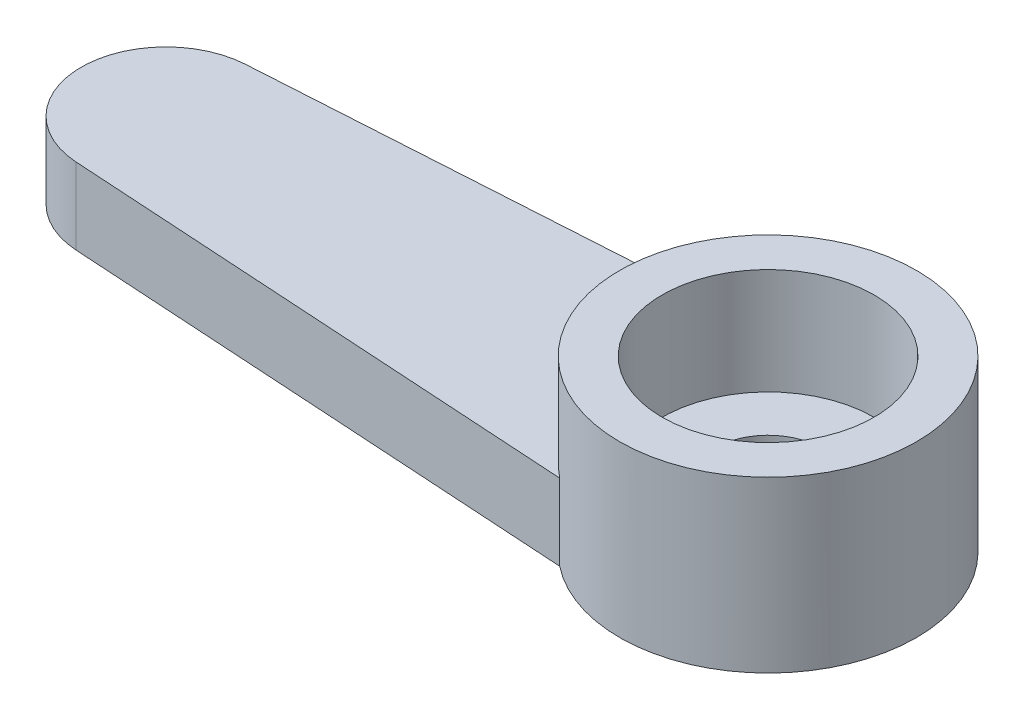
ISO-10303-21;
HEADER;
FILE_DESCRIPTION(('STEP AP214'),'2;1');
FILE_NAME('part.step','',(''),(''),'','','');
FILE_SCHEMA(('AUTOMOTIVE_DESIGN { 1 0 10303 214 1 1 1 1 }'));
ENDSEC;
DATA;
#1=APPLICATION_CONTEXT('core data for automotive mechanical design processes');
#2=APPLICATION_PROTOCOL_DEFINITION('international standard','automotive_design',2000,#1);
#3=PRODUCT_CONTEXT('',#1,'mechanical');
#4=PRODUCT('Part','Part','',(#3));
#5=PRODUCT_RELATED_PRODUCT_CATEGORY('part','',(#4));
#6=PRODUCT_DEFINITION_FORMATION('','',#4);
#7=PRODUCT_DEFINITION_CONTEXT('part definition',#1,'design');
#8=PRODUCT_DEFINITION('design','',#6,#7);
#9=PRODUCT_DEFINITION_SHAPE('','',#8);
#10=(LENGTH_UNIT() NAMED_UNIT(*) SI_UNIT(.MILLI.,.METRE.));
#11=(NAMED_UNIT(*) PLANE_ANGLE_UNIT() SI_UNIT($,.RADIAN.));
#12=(NAMED_UNIT(*) SI_UNIT($,.STERADIAN.) SOLID_ANGLE_UNIT());
#13=UNCERTAINTY_MEASURE_WITH_UNIT(LENGTH_MEASURE(1.E-05),#10,'distance_accuracy_value','');
#14=(GEOMETRIC_REPRESENTATION_CONTEXT(3) GLOBAL_UNCERTAINTY_ASSIGNED_CONTEXT((#13)) GLOBAL_UNIT_ASSIGNED_CONTEXT((#10,
#11,#12)) REPRESENTATION_CONTEXT('',''));
#15=CARTESIAN_POINT('',(0.,0.,0.));
#16=DIRECTION('',(0.,0.,1.));
#17=DIRECTION('',(1.,0.,0.));
#18=AXIS2_PLACEMENT_3D('',#15,#16,#17);
#19=CARTESIAN_POINT('',(0.,4.,0.));
#20=DIRECTION('',(0.,-1.,0.));
#21=DIRECTION('',(0.,0.,-1.));
#22=AXIS2_PLACEMENT_3D('',#19,#20,#21);
#23=CYLINDRICAL_SURFACE('',#22,3.5);
#24=CARTESIAN_POINT('',(0.,4.,0.));
#25=DIRECTION('',(0.,1.,0.));
#26=DIRECTION('',(0.,0.,1.));
#27=AXIS2_PLACEMENT_3D('',#24,#25,#26);
#28=CIRCLE('',#27,3.5);
#29=CARTESIAN_POINT('',(0.,4.,3.5));
#30=VERTEX_POINT('',#29);
#31=EDGE_CURVE('E47',#30,#30,#28,.T.);
#32=ORIENTED_EDGE('',*,*,#31,.F.);
#33=EDGE_LOOP('',(#32));
#34=FACE_BOUND('',#33,.T.);
#35=DIRECTION('',(0.,-1.,0.));
#36=VECTOR('',#35,1.);
#37=CARTESIAN_POINT('',(-2.1650635094611,1.8,-2.75));
#38=LINE('',#37,#36);
#39=CARTESIAN_POINT('',(-2.1650635094611,1.8,-2.75));
#40=VERTEX_POINT('',#39);
#41=CARTESIAN_POINT('',(-2.1650635094611,0.,-2.75));
#42=VERTEX_POINT('',#41);
#43=EDGE_CURVE('E59',#40,#42,#38,.T.);
#44=ORIENTED_EDGE('',*,*,#43,.F.);
#45=CARTESIAN_POINT('',(0.,1.8,0.));
#46=DIRECTION('',(0.,-1.,0.));
#47=DIRECTION('',(0.,0.,1.));
#48=AXIS2_PLACEMENT_3D('',#45,#46,#47);
#49=CIRCLE('',#48,3.5);
#50=CARTESIAN_POINT('',(-2.1650635094611,1.8,2.75));
#51=VERTEX_POINT('',#50);
#52=EDGE_CURVE('E54',#51,#40,#49,.T.);
#53=ORIENTED_EDGE('',*,*,#52,.F.);
#54=DIRECTION('',(0.,-1.,0.));
#55=VECTOR('',#54,1.);
#56=CARTESIAN_POINT('',(-2.1650635094611,1.8,2.75));
#57=LINE('',#56,#55);
#58=CARTESIAN_POINT('',(-2.1650635094611,0.,2.75));
#59=VERTEX_POINT('',#58);
#60=EDGE_CURVE('E104',#51,#59,#57,.T.);
#61=ORIENTED_EDGE('',*,*,#60,.T.);
#62=CARTESIAN_POINT('',(0.,0.,0.));
#63=DIRECTION('',(0.,1.,0.));
#64=DIRECTION('',(0.,0.,1.));
#65=AXIS2_PLACEMENT_3D('',#62,#63,#64);
#66=CIRCLE('',#65,3.5);
#67=EDGE_CURVE('E128',#59,#42,#66,.T.);
#68=ORIENTED_EDGE('',*,*,#67,.T.);
#69=EDGE_LOOP('',(#44,#53,#61,#68));
#70=FACE_BOUND('',#69,.T.);
#71=ADVANCED_FACE('F39',(#34,#70),#23,.T.);
#72=CARTESIAN_POINT('',(0.,4.,0.));
#73=DIRECTION('',(0.,1.,0.));
#74=DIRECTION('',(0.,0.,1.));
#75=AXIS2_PLACEMENT_3D('',#72,#73,#74);
#76=PLANE('',#75);
#77=ORIENTED_EDGE('',*,*,#31,.T.);
#78=EDGE_LOOP('',(#77));
#79=FACE_BOUND('',#78,.T.);
#80=CARTESIAN_POINT('',(0.,4.,0.));
#81=DIRECTION('',(0.,1.,0.));
#82=DIRECTION('',(0.,0.,1.));
#83=AXIS2_PLACEMENT_3D('',#80,#81,#82);
#84=CIRCLE('',#83,2.5);
#85=CARTESIAN_POINT('',(0.,4.,2.5));
#86=VERTEX_POINT('',#85);
#87=EDGE_CURVE('E124',#86,#86,#84,.T.);
#88=ORIENTED_EDGE('',*,*,#87,.F.);
#89=EDGE_LOOP('',(#88));
#90=FACE_BOUND('',#89,.T.);
#91=ADVANCED_FACE('F149',(#79,#90),#76,.T.);
#92=CARTESIAN_POINT('',(0.,0.,0.));
#93=DIRECTION('',(0.,1.,0.));
#94=DIRECTION('',(0.,0.,1.));
#95=AXIS2_PLACEMENT_3D('',#92,#93,#94);
#96=PLANE('',#95);
#97=ORIENTED_EDGE('',*,*,#67,.F.);
#98=DIRECTION('',(0.998083555758428,0.,0.0618806571119953));
#99=VECTOR('',#98,1.);
#100=CARTESIAN_POINT('',(-2.1650635094611,0.,2.75));
#101=LINE('',#100,#99);
#102=CARTESIAN_POINT('',(-14.323761314224,0.,1.99616711151686));
#103=VERTEX_POINT('',#102);
#104=EDGE_CURVE('E114',#103,#59,#101,.T.);
#105=ORIENTED_EDGE('',*,*,#104,.F.);
#106=CARTESIAN_POINT('',(-14.2,0.,0.));
#107=DIRECTION('',(0.,1.,0.));
#108=DIRECTION('',(0.,0.,1.));
#109=AXIS2_PLACEMENT_3D('',#106,#107,#108);
#110=CIRCLE('',#109,2.);
#111=CARTESIAN_POINT('',(-14.323761314224,0.,-1.99616711151685));
#112=VERTEX_POINT('',#111);
#113=EDGE_CURVE('E110',#112,#103,#110,.T.);
#114=ORIENTED_EDGE('',*,*,#113,.F.);
#115=DIRECTION('',(-0.998083555758428,0.,0.0618806571119955));
#116=VECTOR('',#115,1.);
#117=CARTESIAN_POINT('',(-2.1650635094611,0.,-2.75));
#118=LINE('',#117,#116);
#119=EDGE_CURVE('E91',#42,#112,#118,.T.);
#120=ORIENTED_EDGE('',*,*,#119,.F.);
#121=EDGE_LOOP('',(#97,#105,#114,#120));
#122=FACE_BOUND('',#121,.T.);
#123=CARTESIAN_POINT('',(0.,0.,0.));
#124=DIRECTION('',(0.,1.,0.));
#125=DIRECTION('',(0.,0.,1.));
#126=AXIS2_PLACEMENT_3D('',#123,#124,#125);
#127=CIRCLE('',#126,1.25);
#128=CARTESIAN_POINT('',(0.,0.,1.25));
#129=VERTEX_POINT('',#128);
#130=EDGE_CURVE('E179',#129,#129,#127,.T.);
#131=ORIENTED_EDGE('',*,*,#130,.T.);
#132=EDGE_LOOP('',(#131));
#133=FACE_BOUND('',#132,.T.);
#134=ADVANCED_FACE('F135',(#122,#133),#96,.F.);
#135=CARTESIAN_POINT('',(0.,4.,0.));
#136=DIRECTION('',(0.,-1.,0.));
#137=DIRECTION('',(0.,0.,-1.));
#138=AXIS2_PLACEMENT_3D('',#135,#136,#137);
#139=CYLINDRICAL_SURFACE('',#138,2.5);
#140=CARTESIAN_POINT('',(0.,1.5,0.));
#141=DIRECTION('',(0.,1.,0.));
#142=DIRECTION('',(0.,0.,1.));
#143=AXIS2_PLACEMENT_3D('',#140,#141,#142);
#144=CIRCLE('',#143,2.5);
#145=CARTESIAN_POINT('',(0.,1.5,2.5));
#146=VERTEX_POINT('',#145);
#147=EDGE_CURVE('E11',#146,#146,#144,.T.);
#148=ORIENTED_EDGE('',*,*,#147,.F.);
#149=EDGE_LOOP('',(#148));
#150=FACE_BOUND('',#149,.T.);
#151=ORIENTED_EDGE('',*,*,#87,.T.);
#152=EDGE_LOOP('',(#151));
#153=FACE_BOUND('',#152,.T.);
#154=ADVANCED_FACE('F160',(#150,#153),#139,.F.);
#155=CARTESIAN_POINT('',(-2.1650635094611,1.8,-2.75));
#156=DIRECTION('',(0.0618806571119955,0.,0.998083555758428));
#157=DIRECTION('',(0.998083555758428,0.,-0.0618806571119955));
#158=AXIS2_PLACEMENT_3D('',#155,#156,#157);
#159=PLANE('',#158);
#160=ORIENTED_EDGE('',*,*,#119,.T.);
#161=DIRECTION('',(0.,-1.,0.));
#162=VECTOR('',#161,1.);
#163=CARTESIAN_POINT('',(-14.323761314224,1.8,-1.99616711151685));
#164=LINE('',#163,#162);
#165=CARTESIAN_POINT('',(-14.323761314224,1.8,-1.99616711151685));
#166=VERTEX_POINT('',#165);
#167=EDGE_CURVE('E88',#166,#112,#164,.T.);
#168=ORIENTED_EDGE('',*,*,#167,.F.);
#169=DIRECTION('',(-0.998083555758428,0.,0.0618806571119955));
#170=VECTOR('',#169,1.);
#171=CARTESIAN_POINT('',(-2.1650635094611,1.8,-2.75));
#172=LINE('',#171,#170);
#173=EDGE_CURVE('E78',#40,#166,#172,.T.);
#174=ORIENTED_EDGE('',*,*,#173,.F.);
#175=ORIENTED_EDGE('',*,*,#43,.T.);
#176=EDGE_LOOP('',(#160,#168,#174,#175));
#177=FACE_BOUND('',#176,.T.);
#178=ADVANCED_FACE('F89',(#177),#159,.F.);
#179=CARTESIAN_POINT('',(-14.2,1.8,0.));
#180=DIRECTION('',(0.,-1.,0.));
#181=DIRECTION('',(0.,0.,-1.));
#182=AXIS2_PLACEMENT_3D('',#179,#180,#181);
#183=CYLINDRICAL_SURFACE('',#182,2.);
#184=ORIENTED_EDGE('',*,*,#113,.T.);
#185=DIRECTION('',(0.,-1.,0.));
#186=VECTOR('',#185,1.);
#187=CARTESIAN_POINT('',(-14.323761314224,1.8,1.99616711151686));
#188=LINE('',#187,#186);
#189=CARTESIAN_POINT('',(-14.323761314224,1.8,1.99616711151686));
#190=VERTEX_POINT('',#189);
#191=EDGE_CURVE('E95',#190,#103,#188,.T.);
#192=ORIENTED_EDGE('',*,*,#191,.F.);
#193=CARTESIAN_POINT('',(-14.2,1.8,0.));
#194=DIRECTION('',(0.,1.,0.));
#195=DIRECTION('',(0.,0.,1.));
#196=AXIS2_PLACEMENT_3D('',#193,#194,#195);
#197=CIRCLE('',#196,2.);
#198=EDGE_CURVE('E82',#166,#190,#197,.T.);
#199=ORIENTED_EDGE('',*,*,#198,.F.);
#200=ORIENTED_EDGE('',*,*,#167,.T.);
#201=EDGE_LOOP('',(#184,#192,#199,#200));
#202=FACE_BOUND('',#201,.T.);
#203=ADVANCED_FACE('F97',(#202),#183,.T.);
#204=CARTESIAN_POINT('',(-2.1650635094611,1.8,2.75));
#205=DIRECTION('',(0.0618806571119953,0.,-0.998083555758428));
#206=DIRECTION('',(-0.998083555758428,0.,-0.0618806571119953));
#207=AXIS2_PLACEMENT_3D('',#204,#205,#206);
#208=PLANE('',#207);
#209=ORIENTED_EDGE('',*,*,#104,.T.);
#210=ORIENTED_EDGE('',*,*,#60,.F.);
#211=DIRECTION('',(0.998083555758428,0.,0.0618806571119953));
#212=VECTOR('',#211,1.);
#213=CARTESIAN_POINT('',(-2.1650635094611,1.8,2.75));
#214=LINE('',#213,#212);
#215=EDGE_CURVE('E101',#190,#51,#214,.T.);
#216=ORIENTED_EDGE('',*,*,#215,.F.);
#217=ORIENTED_EDGE('',*,*,#191,.T.);
#218=EDGE_LOOP('',(#209,#210,#216,#217));
#219=FACE_BOUND('',#218,.T.);
#220=ADVANCED_FACE('F138',(#219),#208,.F.);
#221=CARTESIAN_POINT('',(0.,1.8,0.));
#222=DIRECTION('',(0.,1.,0.));
#223=DIRECTION('',(0.,0.,1.));
#224=AXIS2_PLACEMENT_3D('',#221,#222,#223);
#225=PLANE('',#224);
#226=ORIENTED_EDGE('',*,*,#52,.T.);
#227=ORIENTED_EDGE('',*,*,#173,.T.);
#228=ORIENTED_EDGE('',*,*,#198,.T.);
#229=ORIENTED_EDGE('',*,*,#215,.T.);
#230=EDGE_LOOP('',(#226,#227,#228,#229));
#231=FACE_BOUND('',#230,.T.);
#232=ADVANCED_FACE('F80',(#231),#225,.T.);
#233=CARTESIAN_POINT('',(0.,1.5,0.));
#234=DIRECTION('',(0.,1.,0.));
#235=DIRECTION('',(0.,0.,1.));
#236=AXIS2_PLACEMENT_3D('',#233,#234,#235);
#237=PLANE('',#236);
#238=ORIENTED_EDGE('',*,*,#147,.T.);
#239=EDGE_LOOP('',(#238));
#240=FACE_BOUND('',#239,.T.);
#241=CARTESIAN_POINT('',(0.,1.5,0.));
#242=DIRECTION('',(0.,1.,0.));
#243=DIRECTION('',(0.,0.,1.));
#244=AXIS2_PLACEMENT_3D('',#241,#242,#243);
#245=CIRCLE('',#244,1.25);
#246=CARTESIAN_POINT('',(0.,1.5,1.25));
#247=VERTEX_POINT('',#246);
#248=EDGE_CURVE('E111',#247,#247,#245,.T.);
#249=ORIENTED_EDGE('',*,*,#248,.F.);
#250=EDGE_LOOP('',(#249));
#251=FACE_BOUND('',#250,.T.);
#252=ADVANCED_FACE('F145',(#240,#251),#237,.T.);
#253=CARTESIAN_POINT('',(0.,1.5,0.));
#254=DIRECTION('',(0.,-1.,0.));
#255=DIRECTION('',(0.,0.,-1.));
#256=AXIS2_PLACEMENT_3D('',#253,#254,#255);
#257=CYLINDRICAL_SURFACE('',#256,1.25);
#258=ORIENTED_EDGE('',*,*,#248,.T.);
#259=EDGE_LOOP('',(#258));
#260=FACE_BOUND('',#259,.T.);
#261=ORIENTED_EDGE('',*,*,#130,.F.);
#262=EDGE_LOOP('',(#261));
#263=FACE_BOUND('',#262,.T.);
#264=ADVANCED_FACE('F173',(#260,#263),#257,.F.);
#265=CLOSED_SHELL('',(#71,#91,#134,#154,#178,#203,#220,#232,#252,#264));
#266=MANIFOLD_SOLID_BREP('B2',#265);
#267=ADVANCED_BREP_SHAPE_REPRESENTATION('',(#18,#266),#14);
#268=SHAPE_DEFINITION_REPRESENTATION(#9,#267);
ENDSEC;
END-ISO-10303-21;
